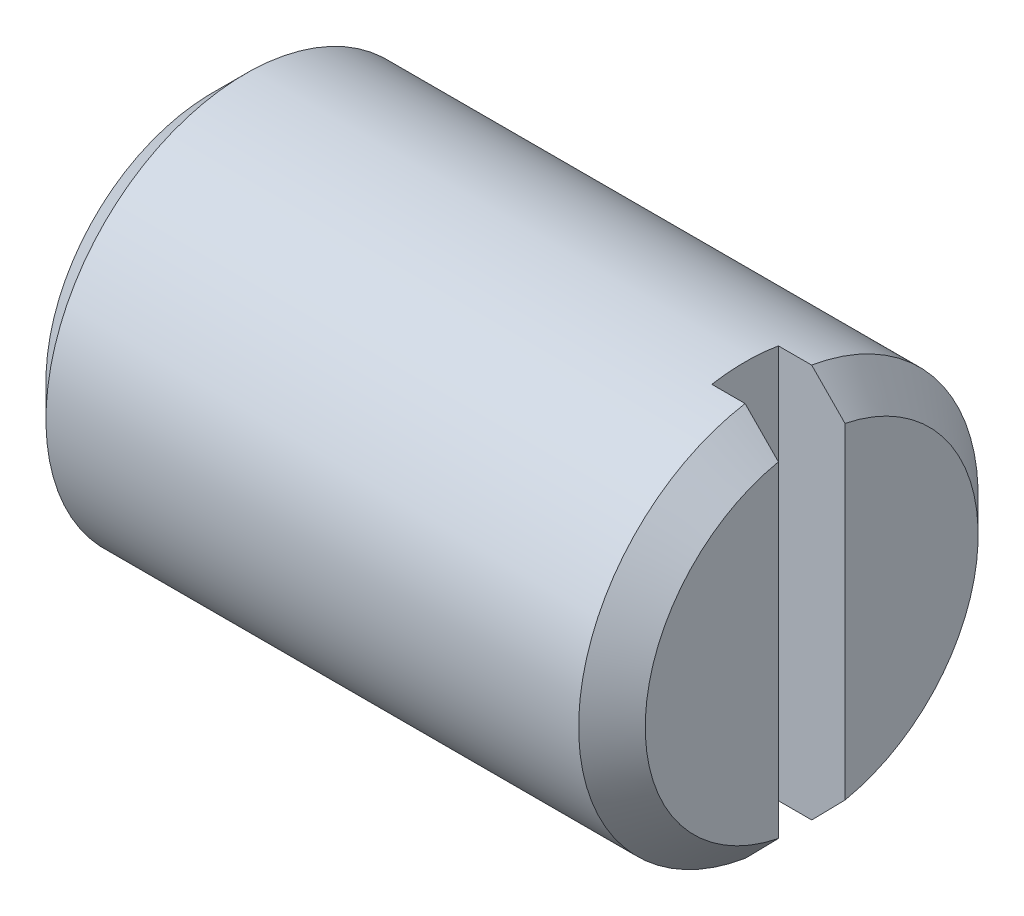
ISO-10303-21;
HEADER;
FILE_DESCRIPTION(('STEP AP214'),'2;1');
FILE_NAME('part.step','',(''),(''),'','','');
FILE_SCHEMA(('AUTOMOTIVE_DESIGN { 1 0 10303 214 1 1 1 1 }'));
ENDSEC;
DATA;
#1=APPLICATION_CONTEXT('core data for automotive mechanical design processes');
#2=APPLICATION_PROTOCOL_DEFINITION('international standard','automotive_design',2000,#1);
#3=PRODUCT_CONTEXT('',#1,'mechanical');
#4=PRODUCT('Part','Part','',(#3));
#5=PRODUCT_RELATED_PRODUCT_CATEGORY('part','',(#4));
#6=PRODUCT_DEFINITION_FORMATION('','',#4);
#7=PRODUCT_DEFINITION_CONTEXT('part definition',#1,'design');
#8=PRODUCT_DEFINITION('design','',#6,#7);
#9=PRODUCT_DEFINITION_SHAPE('','',#8);
#10=(LENGTH_UNIT() NAMED_UNIT(*) SI_UNIT(.MILLI.,.METRE.));
#11=(NAMED_UNIT(*) PLANE_ANGLE_UNIT() SI_UNIT($,.RADIAN.));
#12=(NAMED_UNIT(*) SI_UNIT($,.STERADIAN.) SOLID_ANGLE_UNIT());
#13=UNCERTAINTY_MEASURE_WITH_UNIT(LENGTH_MEASURE(1.E-05),#10,'distance_accuracy_value','');
#14=(GEOMETRIC_REPRESENTATION_CONTEXT(3) GLOBAL_UNCERTAINTY_ASSIGNED_CONTEXT((#13)) GLOBAL_UNIT_ASSIGNED_CONTEXT((#10,
#11,#12)) REPRESENTATION_CONTEXT('',''));
#15=CARTESIAN_POINT('',(0.,0.,0.));
#16=DIRECTION('',(0.,0.,1.));
#17=DIRECTION('',(1.,0.,0.));
#18=AXIS2_PLACEMENT_3D('',#15,#16,#17);
#19=CARTESIAN_POINT('',(9.,0.,0.));
#20=DIRECTION('',(1.,0.,0.));
#21=DIRECTION('',(0.,0.,-1.));
#22=AXIS2_PLACEMENT_3D('',#19,#20,#21);
#23=PLANE('',#22);
#24=DIRECTION('',(0.,1.,0.));
#25=VECTOR('',#24,1.);
#26=CARTESIAN_POINT('',(9.,0.,-0.5));
#27=LINE('',#26,#25);
#28=CARTESIAN_POINT('',(9.,-2.44948974278318,-0.5));
#29=VERTEX_POINT('',#28);
#30=CARTESIAN_POINT('',(9.,2.44948974278318,-0.5));
#31=VERTEX_POINT('',#30);
#32=EDGE_CURVE('E122',#29,#31,#27,.T.);
#33=ORIENTED_EDGE('',*,*,#32,.F.);
#34=CARTESIAN_POINT('',(9.,0.,0.));
#35=DIRECTION('',(1.,0.,0.));
#36=DIRECTION('',(0.,0.,-1.));
#37=AXIS2_PLACEMENT_3D('',#34,#35,#36);
#38=CIRCLE('',#37,2.5);
#39=EDGE_CURVE('E134',#29,#31,#38,.T.);
#40=ORIENTED_EDGE('',*,*,#39,.T.);
#41=EDGE_LOOP('',(#33,#40));
#42=FACE_BOUND('',#41,.T.);
#43=ADVANCED_FACE('F33',(#42),#23,.T.);
#44=CARTESIAN_POINT('',(9.,0.,0.));
#45=DIRECTION('',(-1.,0.,0.));
#46=DIRECTION('',(0.,0.,1.));
#47=AXIS2_PLACEMENT_3D('',#44,#45,#46);
#48=CYLINDRICAL_SURFACE('',#47,3.);
#49=CARTESIAN_POINT('',(0.500000000000002,0.,0.));
#50=DIRECTION('',(1.,0.,0.));
#51=DIRECTION('',(0.,0.,-1.));
#52=AXIS2_PLACEMENT_3D('',#49,#50,#51);
#53=CIRCLE('',#52,3.);
#54=CARTESIAN_POINT('',(0.500000000000002,0.,-3.));
#55=VERTEX_POINT('',#54);
#56=EDGE_CURVE('E128',#55,#55,#53,.T.);
#57=ORIENTED_EDGE('',*,*,#56,.T.);
#58=EDGE_LOOP('',(#57));
#59=FACE_BOUND('',#58,.T.);
#60=DIRECTION('',(-1.,0.,0.));
#61=VECTOR('',#60,1.);
#62=CARTESIAN_POINT('',(9.,2.95803989154981,-0.5));
#63=LINE('',#62,#61);
#64=CARTESIAN_POINT('',(8.,2.95803989154981,-0.5));
#65=VERTEX_POINT('',#64);
#66=CARTESIAN_POINT('',(8.5,2.95803989154981,-0.5));
#67=VERTEX_POINT('',#66);
#68=EDGE_CURVE('E98',#65,#67,#63,.F.);
#69=ORIENTED_EDGE('',*,*,#68,.T.);
#70=CARTESIAN_POINT('',(8.5,0.,0.));
#71=DIRECTION('',(1.,0.,0.));
#72=DIRECTION('',(0.,0.,-1.));
#73=AXIS2_PLACEMENT_3D('',#70,#71,#72);
#74=CIRCLE('',#73,3.);
#75=CARTESIAN_POINT('',(8.5,-2.95803989154981,-0.5));
#76=VERTEX_POINT('',#75);
#77=EDGE_CURVE('E126',#67,#76,#74,.F.);
#78=ORIENTED_EDGE('',*,*,#77,.T.);
#79=DIRECTION('',(-1.,0.,0.));
#80=VECTOR('',#79,1.);
#81=CARTESIAN_POINT('',(9.,-2.95803989154981,-0.5));
#82=LINE('',#81,#80);
#83=CARTESIAN_POINT('',(8.,-2.95803989154981,-0.5));
#84=VERTEX_POINT('',#83);
#85=EDGE_CURVE('E118',#76,#84,#82,.T.);
#86=ORIENTED_EDGE('',*,*,#85,.T.);
#87=CARTESIAN_POINT('',(8.,0.,0.));
#88=DIRECTION('',(-1.,0.,0.));
#89=DIRECTION('',(0.,0.,1.));
#90=AXIS2_PLACEMENT_3D('',#87,#88,#89);
#91=CIRCLE('',#90,3.);
#92=CARTESIAN_POINT('',(8.,-2.95803989154981,0.5));
#93=VERTEX_POINT('',#92);
#94=EDGE_CURVE('E110',#84,#93,#91,.T.);
#95=ORIENTED_EDGE('',*,*,#94,.T.);
#96=DIRECTION('',(-1.,0.,0.));
#97=VECTOR('',#96,1.);
#98=CARTESIAN_POINT('',(9.,-2.95803989154981,0.5));
#99=LINE('',#98,#97);
#100=CARTESIAN_POINT('',(8.5,-2.95803989154981,0.5));
#101=VERTEX_POINT('',#100);
#102=EDGE_CURVE('E99',#93,#101,#99,.F.);
#103=ORIENTED_EDGE('',*,*,#102,.T.);
#104=CARTESIAN_POINT('',(8.5,0.,0.));
#105=DIRECTION('',(1.,0.,0.));
#106=DIRECTION('',(0.,0.,-1.));
#107=AXIS2_PLACEMENT_3D('',#104,#105,#106);
#108=CIRCLE('',#107,3.);
#109=CARTESIAN_POINT('',(8.5,2.95803989154981,0.5));
#110=VERTEX_POINT('',#109);
#111=EDGE_CURVE('E96',#101,#110,#108,.F.);
#112=ORIENTED_EDGE('',*,*,#111,.T.);
#113=DIRECTION('',(-1.,0.,0.));
#114=VECTOR('',#113,1.);
#115=CARTESIAN_POINT('',(9.,2.95803989154981,0.5));
#116=LINE('',#115,#114);
#117=CARTESIAN_POINT('',(8.,2.95803989154981,0.5));
#118=VERTEX_POINT('',#117);
#119=EDGE_CURVE('E90',#110,#118,#116,.T.);
#120=ORIENTED_EDGE('',*,*,#119,.T.);
#121=EDGE_CURVE('E94',#118,#65,#91,.T.);
#122=ORIENTED_EDGE('',*,*,#121,.T.);
#123=EDGE_LOOP('',(#69,#78,#86,#95,#103,#112,#120,#122));
#124=FACE_BOUND('',#123,.T.);
#125=ADVANCED_FACE('F93',(#59,#124),#48,.T.);
#126=DIRECTION('',(0.,-1.,0.));
#127=VECTOR('',#126,1.);
#128=CARTESIAN_POINT('',(9.,0.,0.5));
#129=LINE('',#128,#127);
#130=CARTESIAN_POINT('',(9.,2.44948974278318,0.5));
#131=VERTEX_POINT('',#130);
#132=CARTESIAN_POINT('',(9.,-2.44948974278318,0.5));
#133=VERTEX_POINT('',#132);
#134=EDGE_CURVE('E120',#131,#133,#129,.T.);
#135=ORIENTED_EDGE('',*,*,#134,.F.);
#136=CARTESIAN_POINT('',(9.,0.,0.));
#137=DIRECTION('',(1.,0.,0.));
#138=DIRECTION('',(0.,0.,-1.));
#139=AXIS2_PLACEMENT_3D('',#136,#137,#138);
#140=CIRCLE('',#139,2.5);
#141=EDGE_CURVE('E187',#131,#133,#140,.T.);
#142=ORIENTED_EDGE('',*,*,#141,.T.);
#143=EDGE_LOOP('',(#135,#142));
#144=FACE_BOUND('',#143,.T.);
#145=ADVANCED_FACE('F158',(#144),#23,.T.);
#146=CARTESIAN_POINT('',(0.,0.,0.));
#147=DIRECTION('',(1.,0.,0.));
#148=DIRECTION('',(0.,0.,-1.));
#149=AXIS2_PLACEMENT_3D('',#146,#147,#148);
#150=PLANE('',#149);
#151=CARTESIAN_POINT('',(0.,0.,0.));
#152=DIRECTION('',(1.,0.,0.));
#153=DIRECTION('',(0.,0.,-1.));
#154=AXIS2_PLACEMENT_3D('',#151,#152,#153);
#155=CIRCLE('',#154,2.5);
#156=CARTESIAN_POINT('',(0.,0.,-2.5));
#157=VERTEX_POINT('',#156);
#158=EDGE_CURVE('E131',#157,#157,#155,.F.);
#159=ORIENTED_EDGE('',*,*,#158,.T.);
#160=EDGE_LOOP('',(#159));
#161=FACE_BOUND('',#160,.T.);
#162=ADVANCED_FACE('F162',(#161),#150,.F.);
#163=CARTESIAN_POINT('',(8.,0.,0.));
#164=DIRECTION('',(-1.,0.,0.));
#165=DIRECTION('',(0.,0.,1.));
#166=AXIS2_PLACEMENT_3D('',#163,#164,#165);
#167=PLANE('',#166);
#168=DIRECTION('',(0.,-1.,0.));
#169=VECTOR('',#168,1.);
#170=CARTESIAN_POINT('',(8.,-3.5,0.5));
#171=LINE('',#170,#169);
#172=EDGE_CURVE('E106',#118,#93,#171,.T.);
#173=ORIENTED_EDGE('',*,*,#172,.T.);
#174=ORIENTED_EDGE('',*,*,#94,.F.);
#175=DIRECTION('',(0.,1.,0.));
#176=VECTOR('',#175,1.);
#177=CARTESIAN_POINT('',(8.,-3.5,-0.5));
#178=LINE('',#177,#176);
#179=EDGE_CURVE('E109',#84,#65,#178,.T.);
#180=ORIENTED_EDGE('',*,*,#179,.T.);
#181=ORIENTED_EDGE('',*,*,#121,.F.);
#182=EDGE_LOOP('',(#173,#174,#180,#181));
#183=FACE_BOUND('',#182,.T.);
#184=ADVANCED_FACE('F104',(#183),#167,.F.);
#185=CARTESIAN_POINT('',(8.,-3.5,-0.5));
#186=DIRECTION('',(0.,0.,-1.));
#187=DIRECTION('',(-1.,0.,0.));
#188=AXIS2_PLACEMENT_3D('',#185,#186,#187);
#189=PLANE('',#188);
#190=ORIENTED_EDGE('',*,*,#32,.T.);
#191=CARTESIAN_POINT('',(9.,2.44948974278318,-0.5));
#192=CARTESIAN_POINT('',(8.91679953268421,2.53437874239092,-0.5));
#193=CARTESIAN_POINT('',(8.83353263002843,2.61920242362233,-0.5));
#194=CARTESIAN_POINT('',(8.66686596334692,2.78871913986328,-0.5));
#195=CARTESIAN_POINT('',(8.58346619933603,2.87341217488741,-0.5));
#196=CARTESIAN_POINT('',(8.5,2.95803989154981,-0.5));
#197=B_SPLINE_CURVE_WITH_KNOTS('',3,(#191,#192,#193,#194,#195,#196),.UNSPECIFIED.,.F.,.F.,(4,2,
4),(0.,0.356589267617269,0.713178495396278),.UNSPECIFIED.);
#198=EDGE_CURVE('E143',#31,#67,#197,.T.);
#199=ORIENTED_EDGE('',*,*,#198,.T.);
#200=ORIENTED_EDGE('',*,*,#68,.F.);
#201=ORIENTED_EDGE('',*,*,#179,.F.);
#202=ORIENTED_EDGE('',*,*,#85,.F.);
#203=CARTESIAN_POINT('',(8.5,-2.95803989154981,-0.5));
#204=CARTESIAN_POINT('',(8.58346619933603,-2.87341217488741,-0.5));
#205=CARTESIAN_POINT('',(8.66686596334692,-2.78871913986328,-0.5));
#206=CARTESIAN_POINT('',(8.83353263002843,-2.61920242362233,-0.5));
#207=CARTESIAN_POINT('',(8.91679953268421,-2.53437874239092,-0.5));
#208=CARTESIAN_POINT('',(9.,-2.44948974278318,-0.5));
#209=B_SPLINE_CURVE_WITH_KNOTS('',3,(#203,#204,#205,#206,#207,#208),.UNSPECIFIED.,.F.,.F.,(4,2,
4),(0.,0.356589227779009,0.713178495396278),.UNSPECIFIED.);
#210=EDGE_CURVE('E137',#76,#29,#209,.T.);
#211=ORIENTED_EDGE('',*,*,#210,.T.);
#212=EDGE_LOOP('',(#190,#199,#200,#201,#202,#211));
#213=FACE_BOUND('',#212,.T.);
#214=ADVANCED_FACE('F151',(#213),#189,.F.);
#215=CARTESIAN_POINT('',(8.,-3.5,0.5));
#216=DIRECTION('',(0.,0.,1.));
#217=DIRECTION('',(1.,0.,0.));
#218=AXIS2_PLACEMENT_3D('',#215,#216,#217);
#219=PLANE('',#218);
#220=ORIENTED_EDGE('',*,*,#134,.T.);
#221=CARTESIAN_POINT('',(9.,-2.44948974278318,0.5));
#222=CARTESIAN_POINT('',(8.91679953268421,-2.53437874239092,0.5));
#223=CARTESIAN_POINT('',(8.83353263002843,-2.61920242362233,0.5));
#224=CARTESIAN_POINT('',(8.66686596334692,-2.78871913986328,0.5));
#225=CARTESIAN_POINT('',(8.58346619933603,-2.87341217488741,0.5));
#226=CARTESIAN_POINT('',(8.5,-2.95803989154981,0.5));
#227=B_SPLINE_CURVE_WITH_KNOTS('',3,(#221,#222,#223,#224,#225,#226),.UNSPECIFIED.,.F.,.F.,(4,2,
4),(0.,0.356589267617269,0.713178495396278),.UNSPECIFIED.);
#228=EDGE_CURVE('E11',#133,#101,#227,.T.);
#229=ORIENTED_EDGE('',*,*,#228,.T.);
#230=ORIENTED_EDGE('',*,*,#102,.F.);
#231=ORIENTED_EDGE('',*,*,#172,.F.);
#232=ORIENTED_EDGE('',*,*,#119,.F.);
#233=CARTESIAN_POINT('',(8.5,2.95803989154981,0.5));
#234=CARTESIAN_POINT('',(8.58346619933603,2.87341217488741,0.5));
#235=CARTESIAN_POINT('',(8.66686596334692,2.78871913986328,0.5));
#236=CARTESIAN_POINT('',(8.83353263002843,2.61920242362233,0.5));
#237=CARTESIAN_POINT('',(8.91679953268421,2.53437874239092,0.5));
#238=CARTESIAN_POINT('',(9.,2.44948974278318,0.5));
#239=B_SPLINE_CURVE_WITH_KNOTS('',3,(#233,#234,#235,#236,#237,#238),.UNSPECIFIED.,.F.,.F.,(4,2,
4),(0.,0.356589227779009,0.713178495396278),.UNSPECIFIED.);
#240=EDGE_CURVE('E46',#110,#131,#239,.T.);
#241=ORIENTED_EDGE('',*,*,#240,.T.);
#242=EDGE_LOOP('',(#220,#229,#230,#231,#232,#241));
#243=FACE_BOUND('',#242,.T.);
#244=ADVANCED_FACE('F112',(#243),#219,.F.);
#245=CARTESIAN_POINT('',(0.500000000000002,0.,0.));
#246=DIRECTION('',(1.,0.,0.));
#247=DIRECTION('',(0.,0.,-1.));
#248=AXIS2_PLACEMENT_3D('',#245,#246,#247);
#249=CONICAL_SURFACE('',#248,3.,0.785398163397449);
#250=ORIENTED_EDGE('',*,*,#158,.F.);
#251=EDGE_LOOP('',(#250));
#252=FACE_BOUND('',#251,.T.);
#253=ORIENTED_EDGE('',*,*,#56,.F.);
#254=EDGE_LOOP('',(#253));
#255=FACE_BOUND('',#254,.T.);
#256=ADVANCED_FACE('F169',(#252,#255),#249,.T.);
#257=CARTESIAN_POINT('',(9.,0.,0.));
#258=DIRECTION('',(-1.,0.,0.));
#259=DIRECTION('',(0.,0.,1.));
#260=AXIS2_PLACEMENT_3D('',#257,#258,#259);
#261=CONICAL_SURFACE('',#260,2.5,0.785398163397446);
#262=ORIENTED_EDGE('',*,*,#210,.F.);
#263=ORIENTED_EDGE('',*,*,#77,.F.);
#264=ORIENTED_EDGE('',*,*,#198,.F.);
#265=ORIENTED_EDGE('',*,*,#39,.F.);
#266=EDGE_LOOP('',(#262,#263,#264,#265));
#267=FACE_BOUND('',#266,.T.);
#268=ADVANCED_FACE('F148',(#267),#261,.T.);
#269=CARTESIAN_POINT('',(9.,0.,0.));
#270=DIRECTION('',(-1.,0.,0.));
#271=DIRECTION('',(0.,0.,1.));
#272=AXIS2_PLACEMENT_3D('',#269,#270,#271);
#273=CONICAL_SURFACE('',#272,2.5,0.785398163397446);
#274=ORIENTED_EDGE('',*,*,#240,.F.);
#275=ORIENTED_EDGE('',*,*,#111,.F.);
#276=ORIENTED_EDGE('',*,*,#228,.F.);
#277=ORIENTED_EDGE('',*,*,#141,.F.);
#278=EDGE_LOOP('',(#274,#275,#276,#277));
#279=FACE_BOUND('',#278,.T.);
#280=ADVANCED_FACE('F35',(#279),#273,.T.);
#281=CLOSED_SHELL('',(#43,#125,#145,#162,#184,#214,#244,#256,#268,#280));
#282=MANIFOLD_SOLID_BREP('B2',#281);
#283=ADVANCED_BREP_SHAPE_REPRESENTATION('',(#18,#282),#14);
#284=SHAPE_DEFINITION_REPRESENTATION(#9,#283);
ENDSEC;
END-ISO-10303-21;
